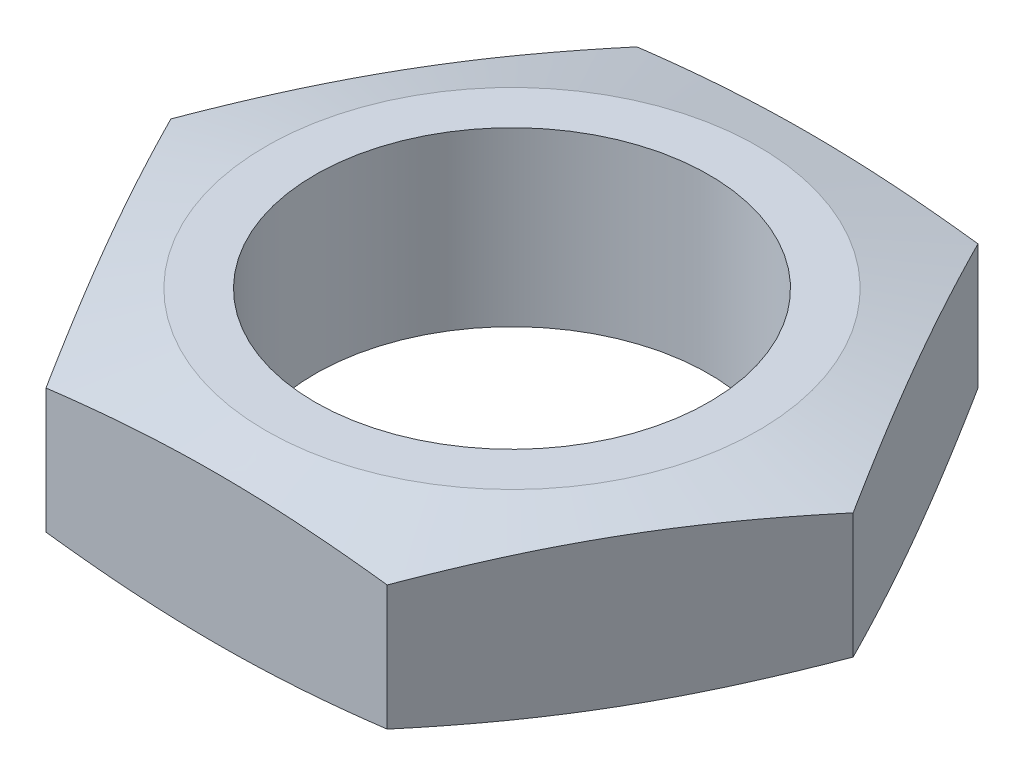
ISO-10303-21;
HEADER;
FILE_DESCRIPTION(('STEP AP214'),'2;1');
FILE_NAME('part.step','',(''),(''),'','','');
FILE_SCHEMA(('AUTOMOTIVE_DESIGN { 1 0 10303 214 1 1 1 1 }'));
ENDSEC;
DATA;
#1=APPLICATION_CONTEXT('core data for automotive mechanical design processes');
#2=APPLICATION_PROTOCOL_DEFINITION('international standard','automotive_design',2000,#1);
#3=PRODUCT_CONTEXT('',#1,'mechanical');
#4=PRODUCT('Part','Part','',(#3));
#5=PRODUCT_RELATED_PRODUCT_CATEGORY('part','',(#4));
#6=PRODUCT_DEFINITION_FORMATION('','',#4);
#7=PRODUCT_DEFINITION_CONTEXT('part definition',#1,'design');
#8=PRODUCT_DEFINITION('design','',#6,#7);
#9=PRODUCT_DEFINITION_SHAPE('','',#8);
#10=(LENGTH_UNIT() NAMED_UNIT(*) SI_UNIT(.MILLI.,.METRE.));
#11=(NAMED_UNIT(*) PLANE_ANGLE_UNIT() SI_UNIT($,.RADIAN.));
#12=(NAMED_UNIT(*) SI_UNIT($,.STERADIAN.) SOLID_ANGLE_UNIT());
#13=UNCERTAINTY_MEASURE_WITH_UNIT(LENGTH_MEASURE(1.E-05),#10,'distance_accuracy_value','');
#14=(GEOMETRIC_REPRESENTATION_CONTEXT(3) GLOBAL_UNCERTAINTY_ASSIGNED_CONTEXT((#13)) GLOBAL_UNIT_ASSIGNED_CONTEXT((#10,
#11,#12)) REPRESENTATION_CONTEXT('',''));
#15=CARTESIAN_POINT('',(0.,0.,0.));
#16=DIRECTION('',(0.,0.,1.));
#17=DIRECTION('',(1.,0.,0.));
#18=AXIS2_PLACEMENT_3D('',#15,#16,#17);
#19=CARTESIAN_POINT('',(0.,0.,0.));
#20=DIRECTION('',(0.,1.,0.));
#21=DIRECTION('',(0.,0.,1.));
#22=AXIS2_PLACEMENT_3D('',#19,#20,#21);
#23=PLANE('',#22);
#24=CARTESIAN_POINT('',(0.,0.,0.));
#25=DIRECTION('',(0.,1.,0.));
#26=DIRECTION('',(0.,0.,1.));
#27=AXIS2_PLACEMENT_3D('',#24,#25,#26);
#28=CIRCLE('',#27,4.);
#29=CARTESIAN_POINT('',(0.,0.,4.));
#30=VERTEX_POINT('',#29);
#31=EDGE_CURVE('E209',#30,#30,#28,.T.);
#32=ORIENTED_EDGE('',*,*,#31,.T.);
#33=EDGE_LOOP('',(#32));
#34=FACE_BOUND('',#33,.T.);
#35=CARTESIAN_POINT('',(0.,0.,0.));
#36=DIRECTION('',(0.,1.,0.));
#37=DIRECTION('',(0.,0.,1.));
#38=AXIS2_PLACEMENT_3D('',#35,#36,#37);
#39=CIRCLE('',#38,5.);
#40=CARTESIAN_POINT('',(0.,0.,5.));
#41=VERTEX_POINT('',#40);
#42=EDGE_CURVE('E108',#41,#41,#39,.T.);
#43=ORIENTED_EDGE('',*,*,#42,.F.);
#44=EDGE_LOOP('',(#43));
#45=FACE_BOUND('',#44,.T.);
#46=ADVANCED_FACE('F37',(#34,#45),#23,.F.);
#47=CARTESIAN_POINT('',(0.,3.5,0.));
#48=DIRECTION('',(0.,1.,0.));
#49=DIRECTION('',(0.,0.,1.));
#50=AXIS2_PLACEMENT_3D('',#47,#48,#49);
#51=PLANE('',#50);
#52=CARTESIAN_POINT('',(0.,3.5,0.));
#53=DIRECTION('',(0.,1.,0.));
#54=DIRECTION('',(0.,0.,1.));
#55=AXIS2_PLACEMENT_3D('',#52,#53,#54);
#56=CIRCLE('',#55,4.);
#57=CARTESIAN_POINT('',(0.,3.5,4.));
#58=VERTEX_POINT('',#57);
#59=EDGE_CURVE('E115',#58,#58,#56,.T.);
#60=ORIENTED_EDGE('',*,*,#59,.F.);
#61=EDGE_LOOP('',(#60));
#62=FACE_BOUND('',#61,.T.);
#63=CARTESIAN_POINT('',(0.,3.5,0.));
#64=DIRECTION('',(0.,1.,0.));
#65=DIRECTION('',(0.,0.,1.));
#66=AXIS2_PLACEMENT_3D('',#63,#64,#65);
#67=CIRCLE('',#66,5.);
#68=CARTESIAN_POINT('',(0.,3.5,5.));
#69=VERTEX_POINT('',#68);
#70=EDGE_CURVE('E236',#69,#69,#67,.T.);
#71=ORIENTED_EDGE('',*,*,#70,.T.);
#72=EDGE_LOOP('',(#71));
#73=FACE_BOUND('',#72,.T.);
#74=ADVANCED_FACE('F223',(#62,#73),#51,.T.);
#75=CARTESIAN_POINT('',(3.46410161513775,3.5,6.));
#76=DIRECTION('',(-0.866025403784439,0.,-0.5));
#77=DIRECTION('',(-0.5,0.,0.866025403784439));
#78=AXIS2_PLACEMENT_3D('',#75,#76,#77);
#79=PLANE('',#78);
#80=DIRECTION('',(0.,-1.,0.));
#81=VECTOR('',#80,1.);
#82=CARTESIAN_POINT('',(3.46410161513775,3.5,6.));
#83=LINE('',#82,#81);
#84=CARTESIAN_POINT('',(3.46410161513775,3.01794919243112,6.));
#85=VERTEX_POINT('',#84);
#86=CARTESIAN_POINT('',(3.46410161513775,0.482050807568877,6.));
#87=VERTEX_POINT('',#86);
#88=EDGE_CURVE('E111',#85,#87,#83,.T.);
#89=ORIENTED_EDGE('',*,*,#88,.T.);
#90=CARTESIAN_POINT('',(3.46398614508391,0.482079675804013,6.0002));
#91=CARTESIAN_POINT('',(3.60791299598261,0.446082306143699,5.75091138167007));
#92=CARTESIAN_POINT('',(3.75206751696797,0.41341285397183,5.50122842718267));
#93=CARTESIAN_POINT('',(4.04081988583842,0.356027888870937,5.00109465349319));
#94=CARTESIAN_POINT('',(4.18541787146394,0.331315169297714,4.75064359571766));
#95=CARTESIAN_POINT('',(4.474293036654,0.291259138583767,4.25029713256363));
#96=CARTESIAN_POINT('',(4.61856873409694,0.275874187563338,4.00040429429503));
#97=CARTESIAN_POINT('',(4.90728044914829,0.255245465624875,3.50034093508575));
#98=CARTESIAN_POINT('',(5.05171643592746,0.25,3.25017046754287));
#99=CARTESIAN_POINT('',(5.3405884094858,0.249999999999999,2.74982953245713));
#100=CARTESIAN_POINT('',(5.48502439626497,0.255245465624875,2.49965906491425));
#101=CARTESIAN_POINT('',(5.77373611131632,0.275874187563337,1.99959570570497));
#102=CARTESIAN_POINT('',(5.91801180875926,0.291259138583766,1.74970286743637));
#103=CARTESIAN_POINT('',(6.20688697394931,0.331315169297713,1.24935640428234));
#104=CARTESIAN_POINT('',(6.35148495957484,0.356027888870936,0.998905346506814));
#105=CARTESIAN_POINT('',(6.64023732844529,0.413412853971829,0.498771572817331));
#106=CARTESIAN_POINT('',(6.78439184943065,0.446082306143699,0.249088618329927));
#107=CARTESIAN_POINT('',(6.92831870032935,0.482079675804012,-0.00020000000000262));
#108=B_SPLINE_CURVE_WITH_KNOTS('',3,(#90,#91,#92,#93,#94,#95,#96,#97,#98,#99,#100,#101,#102,
#103,#104,#105,#106,#107),.UNSPECIFIED.,.F.,.F.,(4,2,2,2,2,2,2,2,4),(0.,0.870326629536244,
1.74095847075901,2.60767456513631,3.47424578463237,4.34081700412843,5.20753309850574,
6.0781649397285,6.94849156926474),.UNSPECIFIED.);
#109=CARTESIAN_POINT('',(6.92820323027551,0.482050807568876,0.));
#110=VERTEX_POINT('',#109);
#111=EDGE_CURVE('E58',#87,#110,#108,.T.);
#112=ORIENTED_EDGE('',*,*,#111,.T.);
#113=DIRECTION('',(0.,-1.,0.));
#114=VECTOR('',#113,1.);
#115=CARTESIAN_POINT('',(6.92820323027551,3.5,0.));
#116=LINE('',#115,#114);
#117=CARTESIAN_POINT('',(6.92820323027551,3.01794919243112,0.));
#118=VERTEX_POINT('',#117);
#119=EDGE_CURVE('E124',#118,#110,#116,.T.);
#120=ORIENTED_EDGE('',*,*,#119,.F.);
#121=CARTESIAN_POINT('',(6.92831870032934,3.01792032419599,-0.000200000000002631));
#122=CARTESIAN_POINT('',(6.78439184943065,3.0539176938563,0.249088618329928));
#123=CARTESIAN_POINT('',(6.64023732844529,3.08658714602817,0.498771572817332));
#124=CARTESIAN_POINT('',(6.35148495957484,3.14397211112906,0.998905346506814));
#125=CARTESIAN_POINT('',(6.20688697394931,3.16868483070229,1.24935640428234));
#126=CARTESIAN_POINT('',(5.91801180875926,3.20874086141623,1.74970286743637));
#127=CARTESIAN_POINT('',(5.77373611131632,3.22412581243666,1.99959570570497));
#128=CARTESIAN_POINT('',(5.48502439626497,3.24475453437513,2.49965906491425));
#129=CARTESIAN_POINT('',(5.3405884094858,3.25,2.74982953245713));
#130=CARTESIAN_POINT('',(5.05171643592746,3.25,3.25017046754287));
#131=CARTESIAN_POINT('',(4.90728044914829,3.24475453437512,3.50034093508575));
#132=CARTESIAN_POINT('',(4.61856873409694,3.22412581243666,4.00040429429504));
#133=CARTESIAN_POINT('',(4.474293036654,3.20874086141623,4.25029713256363));
#134=CARTESIAN_POINT('',(4.18541787146394,3.16868483070229,4.75064359571766));
#135=CARTESIAN_POINT('',(4.04081988583842,3.14397211112906,5.00109465349319));
#136=CARTESIAN_POINT('',(3.75206751696797,3.08658714602817,5.50122842718267));
#137=CARTESIAN_POINT('',(3.60791299598261,3.0539176938563,5.75091138167007));
#138=CARTESIAN_POINT('',(3.46398614508391,3.01792032419599,6.0002));
#139=B_SPLINE_CURVE_WITH_KNOTS('',3,(#121,#122,#123,#124,#125,#126,#127,#128,#129,#130,#131,
#132,#133,#134,#135,#136,#137,#138),.UNSPECIFIED.,.F.,.F.,(4,2,2,2,2,2,2,2,4),(0.,
0.870326629536245,1.74095847075901,2.60767456513631,3.47424578463237,4.34081700412843,
5.20753309850574,6.0781649397285,6.94849156926475),.UNSPECIFIED.);
#140=EDGE_CURVE('E199',#118,#85,#139,.T.);
#141=ORIENTED_EDGE('',*,*,#140,.T.);
#142=EDGE_LOOP('',(#89,#112,#120,#141));
#143=FACE_BOUND('',#142,.T.);
#144=ADVANCED_FACE('F39',(#143),#79,.F.);
#145=CARTESIAN_POINT('',(6.92820323027551,3.5,0.));
#146=DIRECTION('',(-0.866025403784438,0.,0.5));
#147=DIRECTION('',(0.5,0.,0.866025403784439));
#148=AXIS2_PLACEMENT_3D('',#145,#146,#147);
#149=PLANE('',#148);
#150=ORIENTED_EDGE('',*,*,#119,.T.);
#151=CARTESIAN_POINT('',(6.92831870032934,0.482079675804012,0.000199999999997421));
#152=CARTESIAN_POINT('',(6.78439184943065,0.446082306143699,-0.249088618329932));
#153=CARTESIAN_POINT('',(6.64023732844529,0.413412853971829,-0.498771572817336));
#154=CARTESIAN_POINT('',(6.35148495957484,0.356027888870936,-0.998905346506818));
#155=CARTESIAN_POINT('',(6.20688697394931,0.331315169297713,-1.24935640428234));
#156=CARTESIAN_POINT('',(5.91801180875926,0.291259138583766,-1.74970286743637));
#157=CARTESIAN_POINT('',(5.77373611131632,0.275874187563337,-1.99959570570497));
#158=CARTESIAN_POINT('',(5.48502439626497,0.255245465624875,-2.49965906491426));
#159=CARTESIAN_POINT('',(5.3405884094858,0.249999999999999,-2.74982953245713));
#160=CARTESIAN_POINT('',(5.05171643592746,0.249999999999999,-3.25017046754287));
#161=CARTESIAN_POINT('',(4.90728044914829,0.255245465624875,-3.50034093508575));
#162=CARTESIAN_POINT('',(4.61856873409694,0.275874187563338,-4.00040429429503));
#163=CARTESIAN_POINT('',(4.474293036654,0.291259138583767,-4.25029713256363));
#164=CARTESIAN_POINT('',(4.18541787146394,0.331315169297713,-4.75064359571766));
#165=CARTESIAN_POINT('',(4.04081988583842,0.356027888870936,-5.00109465349319));
#166=CARTESIAN_POINT('',(3.75206751696797,0.413412853971829,-5.50122842718267));
#167=CARTESIAN_POINT('',(3.60791299598261,0.446082306143699,-5.75091138167007));
#168=CARTESIAN_POINT('',(3.46398614508391,0.482079675804012,-6.0002));
#169=B_SPLINE_CURVE_WITH_KNOTS('',3,(#151,#152,#153,#154,#155,#156,#157,#158,#159,#160,#161,
#162,#163,#164,#165,#166,#167,#168),.UNSPECIFIED.,.F.,.F.,(4,2,2,2,2,2,2,2,4),(0.,
0.870326629536243,1.740958470759,2.60767456513631,3.47424578463237,4.34081700412843,
5.20753309850573,6.07816493972849,6.94849156926474),.UNSPECIFIED.);
#170=CARTESIAN_POINT('',(3.46410161513775,0.482050807568876,-6.));
#171=VERTEX_POINT('',#170);
#172=EDGE_CURVE('E176',#110,#171,#169,.T.);
#173=ORIENTED_EDGE('',*,*,#172,.T.);
#174=DIRECTION('',(0.,-1.,0.));
#175=VECTOR('',#174,1.);
#176=CARTESIAN_POINT('',(3.46410161513775,3.5,-6.));
#177=LINE('',#176,#175);
#178=CARTESIAN_POINT('',(3.46410161513775,3.01794919243112,-6.));
#179=VERTEX_POINT('',#178);
#180=EDGE_CURVE('E121',#179,#171,#177,.T.);
#181=ORIENTED_EDGE('',*,*,#180,.F.);
#182=CARTESIAN_POINT('',(3.46398614508391,3.01792032419599,-6.0002));
#183=CARTESIAN_POINT('',(3.60791299598261,3.0539176938563,-5.75091138167007));
#184=CARTESIAN_POINT('',(3.75206751696797,3.08658714602817,-5.50122842718267));
#185=CARTESIAN_POINT('',(4.04081988583842,3.14397211112906,-5.00109465349318));
#186=CARTESIAN_POINT('',(4.18541787146395,3.16868483070229,-4.75064359571766));
#187=CARTESIAN_POINT('',(4.474293036654,3.20874086141623,-4.25029713256363));
#188=CARTESIAN_POINT('',(4.61856873409694,3.22412581243666,-4.00040429429503));
#189=CARTESIAN_POINT('',(4.90728044914829,3.24475453437512,-3.50034093508575));
#190=CARTESIAN_POINT('',(5.05171643592746,3.25,-3.25017046754287));
#191=CARTESIAN_POINT('',(5.3405884094858,3.25,-2.74982953245713));
#192=CARTESIAN_POINT('',(5.48502439626497,3.24475453437512,-2.49965906491426));
#193=CARTESIAN_POINT('',(5.77373611131632,3.22412581243666,-1.99959570570497));
#194=CARTESIAN_POINT('',(5.91801180875926,3.20874086141623,-1.74970286743637));
#195=CARTESIAN_POINT('',(6.20688697394931,3.16868483070229,-1.24935640428234));
#196=CARTESIAN_POINT('',(6.35148495957484,3.14397211112906,-0.998905346506818));
#197=CARTESIAN_POINT('',(6.64023732844529,3.08658714602817,-0.498771572817336));
#198=CARTESIAN_POINT('',(6.78439184943065,3.0539176938563,-0.249088618329932));
#199=CARTESIAN_POINT('',(6.92831870032934,3.01792032419599,0.000199999999998099));
#200=B_SPLINE_CURVE_WITH_KNOTS('',3,(#182,#183,#184,#185,#186,#187,#188,#189,#190,#191,#192,
#193,#194,#195,#196,#197,#198,#199),.UNSPECIFIED.,.F.,.F.,(4,2,2,2,2,2,2,2,4),(0.,
0.870326629536244,1.74095847075901,2.60767456513631,3.47424578463237,4.34081700412843,
5.20753309850573,6.07816493972849,6.94849156926474),.UNSPECIFIED.);
#201=EDGE_CURVE('E192',#179,#118,#200,.T.);
#202=ORIENTED_EDGE('',*,*,#201,.T.);
#203=EDGE_LOOP('',(#150,#173,#181,#202));
#204=FACE_BOUND('',#203,.T.);
#205=ADVANCED_FACE('F184',(#204),#149,.F.);
#206=CARTESIAN_POINT('',(3.46410161513775,3.5,-6.));
#207=DIRECTION('',(0.,0.,1.));
#208=DIRECTION('',(1.,0.,0.));
#209=AXIS2_PLACEMENT_3D('',#206,#207,#208);
#210=PLANE('',#209);
#211=ORIENTED_EDGE('',*,*,#180,.T.);
#212=CARTESIAN_POINT('',(-9.17423322965147,1.49051267274986,-6.));
#213=CARTESIAN_POINT('',(-8.90182972676808,1.43353364412052,-6.));
#214=CARTESIAN_POINT('',(-8.62927713678384,1.37725468312102,-6.));
#215=CARTESIAN_POINT('',(-8.08380092016193,1.2664731607591,-6.));
#216=CARTESIAN_POINT('',(-7.81087727994329,1.21197066634669,-6.));
#217=CARTESIAN_POINT('',(-7.26437548743418,1.10507748387411,-6.));
#218=CARTESIAN_POINT('',(-6.99079697673439,1.0526886217299,-6.));
#219=CARTESIAN_POINT('',(-6.44314272850093,0.95057919178749,-6.));
#220=CARTESIAN_POINT('',(-6.16906699464885,0.900858604315271,-6.));
#221=CARTESIAN_POINT('',(-5.62224638174424,0.805052929565263,-6.));
#222=CARTESIAN_POINT('',(-5.34950553812237,0.758944922290212,-6.));
#223=CARTESIAN_POINT('',(-4.80337445053494,0.670757452445999,-6.));
#224=CARTESIAN_POINT('',(-4.52998421909875,0.628677912787756,-6.));
#225=CARTESIAN_POINT('',(-3.98250762589169,0.549488386195094,-6.));
#226=CARTESIAN_POINT('',(-3.70842133907103,0.512377885546651,-6.));
#227=CARTESIAN_POINT('',(-3.15948837210636,0.444211689099953,-6.));
#228=CARTESIAN_POINT('',(-2.88464169156165,0.41315599649306,-6.));
#229=CARTESIAN_POINT('',(-2.33151062300821,0.35800816857275,-6.));
#230=CARTESIAN_POINT('',(-2.05321900413627,0.333987500037012,-6.));
#231=CARTESIAN_POINT('',(-1.4960253142094,0.294481926340998,-6.));
#232=CARTESIAN_POINT('',(-1.21712325507909,0.278996855910514,-6.));
#233=CARTESIAN_POINT('',(-0.659058886005371,0.257449044996384,-6.));
#234=CARTESIAN_POINT('',(-0.379896723256258,0.251382567904947,-6.));
#235=CARTESIAN_POINT('',(0.17846923649888,0.249040038083327,-6.));
#236=CARTESIAN_POINT('',(0.457673033462369,0.252763975418432,-6.));
#237=CARTESIAN_POINT('',(1.01668768229813,0.269794320446198,-6.));
#238=CARTESIAN_POINT('',(1.29649757055305,0.283131732318117,-6.));
#239=CARTESIAN_POINT('',(1.85555141496436,0.318636037885371,-6.));
#240=CARTESIAN_POINT('',(2.13479536048404,0.340803096012409,-6.));
#241=CARTESIAN_POINT('',(2.69271068509262,0.392855962346945,-6.));
#242=CARTESIAN_POINT('',(2.97138165238261,0.422746117268975,-6.));
#243=CARTESIAN_POINT('',(3.52794307533916,0.4890094967451,-6.));
#244=CARTESIAN_POINT('',(3.80583352905615,0.525382737478085,-6.));
#245=CARTESIAN_POINT('',(4.34980119990638,0.601894951353838,-6.));
#246=CARTESIAN_POINT('',(4.61590793229184,0.641826133406714,-6.));
#247=CARTESIAN_POINT('',(5.14749184913678,0.725698715350364,-6.));
#248=CARTESIAN_POINT('',(5.41296901687129,0.769640220581429,-6.));
#249=CARTESIAN_POINT('',(5.94338358270451,0.860786091791574,-6.));
#250=CARTESIAN_POINT('',(6.20832093190465,0.907990740913816,-6.));
#251=CARTESIAN_POINT('',(6.73770985973436,1.00505606132603,-6.));
#252=CARTESIAN_POINT('',(7.00216143248385,1.05491676454998,-6.));
#253=CARTESIAN_POINT('',(7.79502114389458,1.2077482654487,-6.));
#254=CARTESIAN_POINT('',(8.32280652798961,1.3139459792742,-6.));
#255=CARTESIAN_POINT('',(9.37713634807312,1.53212721606324,-6.));
#256=CARTESIAN_POINT('',(9.90368085193043,1.64411041453699,-6.));
#257=CARTESIAN_POINT('',(10.9511969270296,1.8711094505808,-6.));
#258=CARTESIAN_POINT('',(11.4721763128507,1.98608932595033,-6.));
#259=CARTESIAN_POINT('',(12.5135023937464,2.21891245919898,-6.));
#260=CARTESIAN_POINT('',(13.0338490776566,2.33675576685668,-6.));
#261=CARTESIAN_POINT('',(14.0734514950714,2.57440871948367,-6.));
#262=CARTESIAN_POINT('',(14.5927077926461,2.69421590182929,-6.));
#263=CARTESIAN_POINT('',(15.6308288354789,2.93544493921223,-6.));
#264=CARTESIAN_POINT('',(16.1496935921478,3.05686674510904,-6.));
#265=CARTESIAN_POINT('',(16.6684231337661,3.17885658047219,-6.));
#266=B_SPLINE_CURVE_WITH_KNOTS('',3,(#212,#213,#214,#215,#216,#217,#218,#219,#220,#221,#222,
#223,#224,#225,#226,#227,#228,#229,#230,#231,#232,#233,#234,#235,#236,#237,#238,#239,#240,#241,
#242,#243,#244,#245,#246,#247,#248,#249,#250,#251,#252,#253,#254,#255,#256,#257,#258,#259,#260,
#261,#262,#263,#264,#265),.UNSPECIFIED.,.F.,.F.,(4,2,2,2,2,2,2,2,2,2,2,2,2,2,2,2,2,2,2,2,2,2,2,
2,2,2,4),(0.,0.834899671320353,1.66983077134979,2.50546834411569,3.34109975461824,
4.17090794112206,5.00070024517402,5.83040669648592,6.66011358511751,7.49797804055146,
8.33582627229541,9.17334202223063,10.0108569223066,10.8510850261057,11.6913287779382,
12.5320464699201,13.3727662599876,14.1799877654087,14.9872304804505,15.7945433281184,
16.601865884373,18.2169000716766,19.8318437748795,21.4323818721146,23.032947813417,
24.6316405976375,26.2302848370282),.UNSPECIFIED.);
#267=CARTESIAN_POINT('',(-3.46410161513775,0.482050807568877,-6.));
#268=VERTEX_POINT('',#267);
#269=EDGE_CURVE('E171',#171,#268,#266,.F.);
#270=ORIENTED_EDGE('',*,*,#269,.T.);
#271=DIRECTION('',(0.,-1.,0.));
#272=VECTOR('',#271,1.);
#273=CARTESIAN_POINT('',(-3.46410161513775,3.5,-6.));
#274=LINE('',#273,#272);
#275=CARTESIAN_POINT('',(-3.46410161513775,3.01794919243112,-6.));
#276=VERTEX_POINT('',#275);
#277=EDGE_CURVE('E113',#276,#268,#274,.T.);
#278=ORIENTED_EDGE('',*,*,#277,.F.);
#279=CARTESIAN_POINT('',(-9.17423322965147,2.00948732725014,-6.));
#280=CARTESIAN_POINT('',(-8.90182972676808,2.06646635587948,-6.));
#281=CARTESIAN_POINT('',(-8.62927713678384,2.12274531687898,-6.));
#282=CARTESIAN_POINT('',(-8.08380092016193,2.23352683924089,-6.));
#283=CARTESIAN_POINT('',(-7.81087727994329,2.28802933365331,-6.));
#284=CARTESIAN_POINT('',(-7.26437548743418,2.39492251612589,-6.));
#285=CARTESIAN_POINT('',(-6.99079697673439,2.4473113782701,-6.));
#286=CARTESIAN_POINT('',(-6.44314272850093,2.54942080821251,-6.));
#287=CARTESIAN_POINT('',(-6.16906699464885,2.59914139568473,-6.));
#288=CARTESIAN_POINT('',(-5.62224638174424,2.69494707043474,-6.));
#289=CARTESIAN_POINT('',(-5.34950553812237,2.74105507770979,-6.));
#290=CARTESIAN_POINT('',(-4.80337445053494,2.829242547554,-6.));
#291=CARTESIAN_POINT('',(-4.52998421909875,2.87132208721224,-6.));
#292=CARTESIAN_POINT('',(-3.98250762589169,2.95051161380491,-6.));
#293=CARTESIAN_POINT('',(-3.70842133907103,2.98762211445335,-6.));
#294=CARTESIAN_POINT('',(-3.15948837210637,3.05578831090005,-6.));
#295=CARTESIAN_POINT('',(-2.88464169156165,3.08684400350694,-6.));
#296=CARTESIAN_POINT('',(-2.33151062300821,3.14199183142725,-6.));
#297=CARTESIAN_POINT('',(-2.05321900413627,3.16601249996299,-6.));
#298=CARTESIAN_POINT('',(-1.4960253142094,3.205518073659,-6.));
#299=CARTESIAN_POINT('',(-1.21712325507909,3.22100314408949,-6.));
#300=CARTESIAN_POINT('',(-0.659058886005371,3.24255095500362,-6.));
#301=CARTESIAN_POINT('',(-0.379896723256258,3.24861743209505,-6.));
#302=CARTESIAN_POINT('',(0.17846923649888,3.25095996191667,-6.));
#303=CARTESIAN_POINT('',(0.45767303346237,3.24723602458157,-6.));
#304=CARTESIAN_POINT('',(1.01668768229813,3.2302056795538,-6.));
#305=CARTESIAN_POINT('',(1.29649757055305,3.21686826768188,-6.));
#306=CARTESIAN_POINT('',(1.85555141496436,3.18136396211463,-6.));
#307=CARTESIAN_POINT('',(2.13479536048404,3.15919690398759,-6.));
#308=CARTESIAN_POINT('',(2.69271068509262,3.10714403765305,-6.));
#309=CARTESIAN_POINT('',(2.97138165238261,3.07725388273102,-6.));
#310=CARTESIAN_POINT('',(3.52794307533916,3.0109905032549,-6.));
#311=CARTESIAN_POINT('',(3.80583352905615,2.97461726252191,-6.));
#312=CARTESIAN_POINT('',(4.34980119990638,2.89810504864616,-6.));
#313=CARTESIAN_POINT('',(4.61590793229184,2.85817386659329,-6.));
#314=CARTESIAN_POINT('',(5.14749184913678,2.77430128464964,-6.));
#315=CARTESIAN_POINT('',(5.41296901687128,2.73035977941857,-6.));
#316=CARTESIAN_POINT('',(5.94338358270451,2.63921390820843,-6.));
#317=CARTESIAN_POINT('',(6.20832093190464,2.59200925908618,-6.));
#318=CARTESIAN_POINT('',(6.73770985973436,2.49494393867397,-6.));
#319=CARTESIAN_POINT('',(7.00216143248385,2.44508323545002,-6.));
#320=CARTESIAN_POINT('',(7.79502114389457,2.2922517345513,-6.));
#321=CARTESIAN_POINT('',(8.32280652798961,2.1860540207258,-6.));
#322=CARTESIAN_POINT('',(9.37713634807312,1.96787278393676,-6.));
#323=CARTESIAN_POINT('',(9.90368085193043,1.85588958546301,-6.));
#324=CARTESIAN_POINT('',(10.9511969270296,1.6288905494192,-6.));
#325=CARTESIAN_POINT('',(11.4721763128507,1.51391067404967,-6.));
#326=CARTESIAN_POINT('',(12.5135023937464,1.28108754080102,-6.));
#327=CARTESIAN_POINT('',(13.0338490776566,1.16324423314332,-6.));
#328=CARTESIAN_POINT('',(14.0734514950714,0.925591280516326,-6.));
#329=CARTESIAN_POINT('',(14.5927077926461,0.805784098170715,-6.));
#330=CARTESIAN_POINT('',(15.6308288354789,0.564555060787767,-6.));
#331=CARTESIAN_POINT('',(16.1496935921478,0.443133254890965,-6.));
#332=CARTESIAN_POINT('',(16.6684231337661,0.321143419527806,-6.));
#333=B_SPLINE_CURVE_WITH_KNOTS('',3,(#279,#280,#281,#282,#283,#284,#285,#286,#287,#288,#289,
#290,#291,#292,#293,#294,#295,#296,#297,#298,#299,#300,#301,#302,#303,#304,#305,#306,#307,#308,
#309,#310,#311,#312,#313,#314,#315,#316,#317,#318,#319,#320,#321,#322,#323,#324,#325,#326,#327,
#328,#329,#330,#331,#332),.UNSPECIFIED.,.F.,.F.,(4,2,2,2,2,2,2,2,2,2,2,2,2,2,2,2,2,2,2,2,2,2,2,
2,2,2,4),(0.,0.834899671320355,1.66983077134979,2.50546834411569,3.34109975461824,
4.17090794112206,5.00070024517402,5.83040669648592,6.66011358511752,7.49797804055146,
8.33582627229541,9.17334202223063,10.0108569223066,10.8510850261057,11.6913287779382,
12.5320464699201,13.3727662599876,14.1799877654087,14.9872304804505,15.7945433281184,
16.601865884373,18.2169000716766,19.8318437748795,21.4323818721146,23.032947813417,
24.6316405976375,26.2302848370282),.UNSPECIFIED.);
#334=EDGE_CURVE('E200',#276,#179,#333,.T.);
#335=ORIENTED_EDGE('',*,*,#334,.T.);
#336=EDGE_LOOP('',(#211,#270,#278,#335));
#337=FACE_BOUND('',#336,.T.);
#338=ADVANCED_FACE('F187',(#337),#210,.F.);
#339=CARTESIAN_POINT('',(-3.46410161513775,3.5,-6.));
#340=DIRECTION('',(0.866025403784439,0.,0.5));
#341=DIRECTION('',(0.5,0.,-0.866025403784439));
#342=AXIS2_PLACEMENT_3D('',#339,#340,#341);
#343=PLANE('',#342);
#344=ORIENTED_EDGE('',*,*,#277,.T.);
#345=CARTESIAN_POINT('',(-3.46398614508391,0.482079675804012,-6.0002));
#346=CARTESIAN_POINT('',(-3.60791299598261,0.446082306143699,-5.75091138167007));
#347=CARTESIAN_POINT('',(-3.75206751696797,0.413412853971829,-5.50122842718267));
#348=CARTESIAN_POINT('',(-4.04081988583842,0.356027888870936,-5.00109465349318));
#349=CARTESIAN_POINT('',(-4.18541787146395,0.331315169297713,-4.75064359571766));
#350=CARTESIAN_POINT('',(-4.474293036654,0.291259138583767,-4.25029713256363));
#351=CARTESIAN_POINT('',(-4.61856873409694,0.275874187563337,-4.00040429429503));
#352=CARTESIAN_POINT('',(-4.90728044914829,0.255245465624874,-3.50034093508574));
#353=CARTESIAN_POINT('',(-5.05171643592746,0.249999999999999,-3.25017046754287));
#354=CARTESIAN_POINT('',(-5.3405884094858,0.249999999999999,-2.74982953245713));
#355=CARTESIAN_POINT('',(-5.48502439626497,0.255245465624875,-2.49965906491425));
#356=CARTESIAN_POINT('',(-5.77373611131632,0.275874187563337,-1.99959570570497));
#357=CARTESIAN_POINT('',(-5.91801180875926,0.291259138583766,-1.74970286743637));
#358=CARTESIAN_POINT('',(-6.20688697394931,0.331315169297713,-1.24935640428234));
#359=CARTESIAN_POINT('',(-6.35148495957484,0.356027888870936,-0.998905346506814));
#360=CARTESIAN_POINT('',(-6.64023732844529,0.41341285397183,-0.498771572817332));
#361=CARTESIAN_POINT('',(-6.78439184943065,0.446082306143699,-0.249088618329928));
#362=CARTESIAN_POINT('',(-6.92831870032935,0.482079675804012,0.000200000000002221));
#363=B_SPLINE_CURVE_WITH_KNOTS('',3,(#345,#346,#347,#348,#349,#350,#351,#352,#353,#354,#355,
#356,#357,#358,#359,#360,#361,#362),.UNSPECIFIED.,.F.,.F.,(4,2,2,2,2,2,2,2,4),(0.,
0.870326629536244,1.74095847075901,2.60767456513631,3.47424578463237,4.34081700412843,
5.20753309850574,6.0781649397285,6.94849156926474),.UNSPECIFIED.);
#364=CARTESIAN_POINT('',(-6.92820323027551,0.482050807568877,0.));
#365=VERTEX_POINT('',#364);
#366=EDGE_CURVE('E107',#268,#365,#363,.T.);
#367=ORIENTED_EDGE('',*,*,#366,.T.);
#368=DIRECTION('',(0.,-1.,0.));
#369=VECTOR('',#368,1.);
#370=CARTESIAN_POINT('',(-6.92820323027551,3.5,0.));
#371=LINE('',#370,#369);
#372=CARTESIAN_POINT('',(-6.92820323027551,3.01794919243112,0.));
#373=VERTEX_POINT('',#372);
#374=EDGE_CURVE('E106',#373,#365,#371,.T.);
#375=ORIENTED_EDGE('',*,*,#374,.F.);
#376=CARTESIAN_POINT('',(-6.92831870032935,3.01792032419599,0.00020000000000348));
#377=CARTESIAN_POINT('',(-6.78439184943065,3.0539176938563,-0.249088618329927));
#378=CARTESIAN_POINT('',(-6.64023732844529,3.08658714602817,-0.498771572817331));
#379=CARTESIAN_POINT('',(-6.35148495957484,3.14397211112906,-0.998905346506813));
#380=CARTESIAN_POINT('',(-6.20688697394932,3.16868483070229,-1.24935640428234));
#381=CARTESIAN_POINT('',(-5.91801180875926,3.20874086141623,-1.74970286743637));
#382=CARTESIAN_POINT('',(-5.77373611131633,3.22412581243666,-1.99959570570496));
#383=CARTESIAN_POINT('',(-5.48502439626498,3.24475453437513,-2.49965906491425));
#384=CARTESIAN_POINT('',(-5.3405884094858,3.25,-2.74982953245712));
#385=CARTESIAN_POINT('',(-5.05171643592746,3.25,-3.25017046754287));
#386=CARTESIAN_POINT('',(-4.90728044914829,3.24475453437513,-3.50034093508574));
#387=CARTESIAN_POINT('',(-4.61856873409694,3.22412581243666,-4.00040429429503));
#388=CARTESIAN_POINT('',(-4.474293036654,3.20874086141623,-4.25029713256363));
#389=CARTESIAN_POINT('',(-4.18541787146395,3.16868483070229,-4.75064359571766));
#390=CARTESIAN_POINT('',(-4.04081988583842,3.14397211112906,-5.00109465349318));
#391=CARTESIAN_POINT('',(-3.75206751696797,3.08658714602817,-5.50122842718266));
#392=CARTESIAN_POINT('',(-3.60791299598261,3.0539176938563,-5.75091138167007));
#393=CARTESIAN_POINT('',(-3.46398614508391,3.01792032419599,-6.0002));
#394=B_SPLINE_CURVE_WITH_KNOTS('',3,(#376,#377,#378,#379,#380,#381,#382,#383,#384,#385,#386,
#387,#388,#389,#390,#391,#392,#393),.UNSPECIFIED.,.F.,.F.,(4,2,2,2,2,2,2,2,4),(0.,
0.870326629536244,1.74095847075901,2.60767456513631,3.47424578463237,4.34081700412843,
5.20753309850574,6.0781649397285,6.94849156926474),.UNSPECIFIED.);
#395=EDGE_CURVE('E237',#373,#276,#394,.T.);
#396=ORIENTED_EDGE('',*,*,#395,.T.);
#397=EDGE_LOOP('',(#344,#367,#375,#396));
#398=FACE_BOUND('',#397,.T.);
#399=ADVANCED_FACE('F143',(#398),#343,.F.);
#400=CARTESIAN_POINT('',(-6.92820323027551,3.5,0.));
#401=DIRECTION('',(0.866025403784439,0.,-0.5));
#402=DIRECTION('',(-0.5,0.,-0.866025403784439));
#403=AXIS2_PLACEMENT_3D('',#400,#401,#402);
#404=PLANE('',#403);
#405=ORIENTED_EDGE('',*,*,#374,.T.);
#406=CARTESIAN_POINT('',(-6.92831870032935,0.482079675804012,-0.000199999999996577));
#407=CARTESIAN_POINT('',(-6.78439184943065,0.446082306143699,0.249088618329934));
#408=CARTESIAN_POINT('',(-6.64023732844529,0.41341285397183,0.498771572817337));
#409=CARTESIAN_POINT('',(-6.35148495957484,0.356027888870937,0.998905346506819));
#410=CARTESIAN_POINT('',(-6.20688697394932,0.331315169297714,1.24935640428235));
#411=CARTESIAN_POINT('',(-5.91801180875926,0.291259138583767,1.74970286743637));
#412=CARTESIAN_POINT('',(-5.77373611131633,0.275874187563338,1.99959570570497));
#413=CARTESIAN_POINT('',(-5.48502439626498,0.255245465624876,2.49965906491426));
#414=CARTESIAN_POINT('',(-5.3405884094858,0.25,2.74982953245713));
#415=CARTESIAN_POINT('',(-5.05171643592746,0.25,3.25017046754288));
#416=CARTESIAN_POINT('',(-4.90728044914829,0.255245465624876,3.50034093508575));
#417=CARTESIAN_POINT('',(-4.61856873409694,0.275874187563339,4.00040429429504));
#418=CARTESIAN_POINT('',(-4.474293036654,0.291259138583768,4.25029713256364));
#419=CARTESIAN_POINT('',(-4.18541787146395,0.331315169297714,4.75064359571766));
#420=CARTESIAN_POINT('',(-4.04081988583842,0.356027888870937,5.00109465349319));
#421=CARTESIAN_POINT('',(-3.75206751696798,0.41341285397183,5.50122842718267));
#422=CARTESIAN_POINT('',(-3.60791299598261,0.4460823061437,5.75091138167007));
#423=CARTESIAN_POINT('',(-3.46398614508392,0.482079675804013,6.0002));
#424=B_SPLINE_CURVE_WITH_KNOTS('',3,(#406,#407,#408,#409,#410,#411,#412,#413,#414,#415,#416,
#417,#418,#419,#420,#421,#422,#423),.UNSPECIFIED.,.F.,.F.,(4,2,2,2,2,2,2,2,4),(0.,
0.870326629536244,1.74095847075901,2.60767456513631,3.47424578463237,4.34081700412843,
5.20753309850573,6.0781649397285,6.94849156926474),.UNSPECIFIED.);
#425=CARTESIAN_POINT('',(-3.46410161513776,0.482050807568876,6.));
#426=VERTEX_POINT('',#425);
#427=EDGE_CURVE('E94',#365,#426,#424,.T.);
#428=ORIENTED_EDGE('',*,*,#427,.T.);
#429=DIRECTION('',(0.,-1.,0.));
#430=VECTOR('',#429,1.);
#431=CARTESIAN_POINT('',(-3.46410161513775,3.5,6.));
#432=LINE('',#431,#430);
#433=CARTESIAN_POINT('',(-3.46410161513775,3.01794919243112,6.));
#434=VERTEX_POINT('',#433);
#435=EDGE_CURVE('E104',#434,#426,#432,.T.);
#436=ORIENTED_EDGE('',*,*,#435,.F.);
#437=CARTESIAN_POINT('',(-3.46398614508392,3.01792032419599,6.0002));
#438=CARTESIAN_POINT('',(-3.60791299598261,3.0539176938563,5.75091138167007));
#439=CARTESIAN_POINT('',(-3.75206751696798,3.08658714602817,5.50122842718267));
#440=CARTESIAN_POINT('',(-4.04081988583842,3.14397211112906,5.00109465349319));
#441=CARTESIAN_POINT('',(-4.18541787146395,3.16868483070229,4.75064359571766));
#442=CARTESIAN_POINT('',(-4.474293036654,3.20874086141623,4.25029713256364));
#443=CARTESIAN_POINT('',(-4.61856873409694,3.22412581243666,4.00040429429504));
#444=CARTESIAN_POINT('',(-4.90728044914829,3.24475453437512,3.50034093508575));
#445=CARTESIAN_POINT('',(-5.05171643592746,3.25,3.25017046754288));
#446=CARTESIAN_POINT('',(-5.3405884094858,3.25,2.74982953245713));
#447=CARTESIAN_POINT('',(-5.48502439626498,3.24475453437512,2.49965906491426));
#448=CARTESIAN_POINT('',(-5.77373611131633,3.22412581243666,1.99959570570497));
#449=CARTESIAN_POINT('',(-5.91801180875926,3.20874086141623,1.74970286743637));
#450=CARTESIAN_POINT('',(-6.20688697394932,3.16868483070229,1.24935640428234));
#451=CARTESIAN_POINT('',(-6.35148495957484,3.14397211112906,0.998905346506819));
#452=CARTESIAN_POINT('',(-6.64023732844529,3.08658714602817,0.498771572817337));
#453=CARTESIAN_POINT('',(-6.78439184943065,3.0539176938563,0.249088618329933));
#454=CARTESIAN_POINT('',(-6.92831870032935,3.01792032419599,-0.000199999999997));
#455=B_SPLINE_CURVE_WITH_KNOTS('',3,(#437,#438,#439,#440,#441,#442,#443,#444,#445,#446,#447,
#448,#449,#450,#451,#452,#453,#454),.UNSPECIFIED.,.F.,.F.,(4,2,2,2,2,2,2,2,4),(0.,
0.870326629536244,1.74095847075901,2.60767456513631,3.47424578463237,4.34081700412843,
5.20753309850573,6.0781649397285,6.94849156926474),.UNSPECIFIED.);
#456=EDGE_CURVE('E65',#434,#373,#455,.T.);
#457=ORIENTED_EDGE('',*,*,#456,.T.);
#458=EDGE_LOOP('',(#405,#428,#436,#457));
#459=FACE_BOUND('',#458,.T.);
#460=ADVANCED_FACE('F103',(#459),#404,.F.);
#461=CARTESIAN_POINT('',(-3.46410161513775,3.5,6.));
#462=DIRECTION('',(0.,0.,-1.));
#463=DIRECTION('',(-1.,0.,0.));
#464=AXIS2_PLACEMENT_3D('',#461,#462,#463);
#465=PLANE('',#464);
#466=ORIENTED_EDGE('',*,*,#435,.T.);
#467=CARTESIAN_POINT('',(-9.17423322965148,1.49051267274986,6.));
#468=CARTESIAN_POINT('',(-8.90182972676809,1.43353364412052,6.));
#469=CARTESIAN_POINT('',(-8.62927713678385,1.37725468312102,6.));
#470=CARTESIAN_POINT('',(-8.08380092016193,1.26647316075911,6.));
#471=CARTESIAN_POINT('',(-7.81087727994329,1.21197066634669,6.));
#472=CARTESIAN_POINT('',(-7.26437548743419,1.10507748387411,6.));
#473=CARTESIAN_POINT('',(-6.99079697673439,1.0526886217299,6.));
#474=CARTESIAN_POINT('',(-6.44314272850093,0.950579191787491,6.));
#475=CARTESIAN_POINT('',(-6.16906699464886,0.900858604315272,6.));
#476=CARTESIAN_POINT('',(-5.62224638174424,0.805052929565264,6.));
#477=CARTESIAN_POINT('',(-5.34950553812237,0.758944922290213,6.));
#478=CARTESIAN_POINT('',(-4.80337445053494,0.670757452446,6.));
#479=CARTESIAN_POINT('',(-4.52998421909875,0.628677912787757,6.));
#480=CARTESIAN_POINT('',(-3.9825076258917,0.549488386195095,6.));
#481=CARTESIAN_POINT('',(-3.70842133907103,0.512377885546652,6.));
#482=CARTESIAN_POINT('',(-3.15948837210637,0.444211689099954,6.));
#483=CARTESIAN_POINT('',(-2.88464169156166,0.413155996493061,6.));
#484=CARTESIAN_POINT('',(-2.33151062300821,0.358008168572751,6.));
#485=CARTESIAN_POINT('',(-2.05321900413627,0.333987500037013,6.));
#486=CARTESIAN_POINT('',(-1.4960253142094,0.294481926341,6.));
#487=CARTESIAN_POINT('',(-1.2171232550791,0.278996855910515,6.));
#488=CARTESIAN_POINT('',(-0.659058886005373,0.257449044996385,6.));
#489=CARTESIAN_POINT('',(-0.37989672325626,0.251382567904948,6.));
#490=CARTESIAN_POINT('',(0.178469236498878,0.249040038083328,6.));
#491=CARTESIAN_POINT('',(0.457673033462368,0.252763975418433,6.));
#492=CARTESIAN_POINT('',(1.01668768229812,0.269794320446199,6.));
#493=CARTESIAN_POINT('',(1.29649757055305,0.283131732318118,6.));
#494=CARTESIAN_POINT('',(1.85555141496436,0.318636037885371,6.));
#495=CARTESIAN_POINT('',(2.13479536048404,0.34080309601241,6.));
#496=CARTESIAN_POINT('',(2.69271068509262,0.392855962346946,6.));
#497=CARTESIAN_POINT('',(2.97138165238261,0.422746117268976,6.));
#498=CARTESIAN_POINT('',(3.52794307533916,0.489009496745101,6.));
#499=CARTESIAN_POINT('',(3.80583352905615,0.525382737478086,6.));
#500=CARTESIAN_POINT('',(4.34980119990639,0.60189495135384,6.));
#501=CARTESIAN_POINT('',(4.61590793229184,0.641826133406715,6.));
#502=CARTESIAN_POINT('',(5.14749184913678,0.725698715350365,6.));
#503=CARTESIAN_POINT('',(5.41296901687129,0.769640220581429,6.));
#504=CARTESIAN_POINT('',(5.94338358270451,0.860786091791575,6.));
#505=CARTESIAN_POINT('',(6.20832093190465,0.907990740913816,6.));
#506=CARTESIAN_POINT('',(6.73770985973436,1.00505606132603,6.));
#507=CARTESIAN_POINT('',(7.00216143248385,1.05491676454998,6.));
#508=CARTESIAN_POINT('',(7.79502114389457,1.2077482654487,6.));
#509=CARTESIAN_POINT('',(8.32280652798961,1.3139459792742,6.));
#510=CARTESIAN_POINT('',(9.37713634807312,1.53212721606324,6.));
#511=CARTESIAN_POINT('',(9.90368085193043,1.64411041453699,6.));
#512=CARTESIAN_POINT('',(10.9511969270296,1.8711094505808,6.));
#513=CARTESIAN_POINT('',(11.4721763128507,1.98608932595033,6.));
#514=CARTESIAN_POINT('',(12.5135023937464,2.21891245919898,6.));
#515=CARTESIAN_POINT('',(13.0338490776566,2.33675576685669,6.));
#516=CARTESIAN_POINT('',(14.0734514950714,2.57440871948367,6.));
#517=CARTESIAN_POINT('',(14.5927077926461,2.69421590182929,6.));
#518=CARTESIAN_POINT('',(15.6308288354789,2.93544493921223,6.));
#519=CARTESIAN_POINT('',(16.1496935921479,3.05686674510904,6.));
#520=CARTESIAN_POINT('',(16.6684231337661,3.1788565804722,6.));
#521=B_SPLINE_CURVE_WITH_KNOTS('',3,(#467,#468,#469,#470,#471,#472,#473,#474,#475,#476,#477,
#478,#479,#480,#481,#482,#483,#484,#485,#486,#487,#488,#489,#490,#491,#492,#493,#494,#495,#496,
#497,#498,#499,#500,#501,#502,#503,#504,#505,#506,#507,#508,#509,#510,#511,#512,#513,#514,#515,
#516,#517,#518,#519,#520),.UNSPECIFIED.,.F.,.F.,(4,2,2,2,2,2,2,2,2,2,2,2,2,2,2,2,2,2,2,2,2,2,2,
2,2,2,4),(0.,0.834899671320355,1.66983077134979,2.5054683441157,3.34109975461824,
4.17090794112206,5.00070024517402,5.83040669648592,6.66011358511752,7.49797804055147,
8.33582627229542,9.17334202223063,10.0108569223066,10.8510850261057,11.6913287779382,
12.5320464699201,13.3727662599876,14.1799877654087,14.9872304804506,15.7945433281184,
16.601865884373,18.2169000716766,19.8318437748795,21.4323818721146,23.032947813417,
24.6316405976375,26.2302848370282),.UNSPECIFIED.);
#522=EDGE_CURVE('E11',#426,#87,#521,.T.);
#523=ORIENTED_EDGE('',*,*,#522,.T.);
#524=ORIENTED_EDGE('',*,*,#88,.F.);
#525=CARTESIAN_POINT('',(-9.17423322965148,2.00948732725014,6.));
#526=CARTESIAN_POINT('',(-8.90182972676809,2.06646635587948,6.));
#527=CARTESIAN_POINT('',(-8.62927713678385,2.12274531687898,6.));
#528=CARTESIAN_POINT('',(-8.08380092016193,2.23352683924089,6.));
#529=CARTESIAN_POINT('',(-7.81087727994329,2.28802933365331,6.));
#530=CARTESIAN_POINT('',(-7.26437548743419,2.39492251612589,6.));
#531=CARTESIAN_POINT('',(-6.99079697673439,2.4473113782701,6.));
#532=CARTESIAN_POINT('',(-6.44314272850093,2.54942080821251,6.));
#533=CARTESIAN_POINT('',(-6.16906699464886,2.59914139568473,6.));
#534=CARTESIAN_POINT('',(-5.62224638174424,2.69494707043474,6.));
#535=CARTESIAN_POINT('',(-5.34950553812237,2.74105507770979,6.));
#536=CARTESIAN_POINT('',(-4.80337445053494,2.829242547554,6.));
#537=CARTESIAN_POINT('',(-4.52998421909875,2.87132208721224,6.));
#538=CARTESIAN_POINT('',(-3.9825076258917,2.9505116138049,6.));
#539=CARTESIAN_POINT('',(-3.70842133907103,2.98762211445335,6.));
#540=CARTESIAN_POINT('',(-3.15948837210637,3.05578831090005,6.));
#541=CARTESIAN_POINT('',(-2.88464169156166,3.08684400350694,6.));
#542=CARTESIAN_POINT('',(-2.33151062300821,3.14199183142725,6.));
#543=CARTESIAN_POINT('',(-2.05321900413627,3.16601249996299,6.));
#544=CARTESIAN_POINT('',(-1.4960253142094,3.205518073659,6.));
#545=CARTESIAN_POINT('',(-1.21712325507909,3.22100314408948,6.));
#546=CARTESIAN_POINT('',(-0.659058886005372,3.24255095500361,6.));
#547=CARTESIAN_POINT('',(-0.379896723256259,3.24861743209505,6.));
#548=CARTESIAN_POINT('',(0.178469236498879,3.25095996191667,6.));
#549=CARTESIAN_POINT('',(0.457673033462368,3.24723602458157,6.));
#550=CARTESIAN_POINT('',(1.01668768229813,3.2302056795538,6.));
#551=CARTESIAN_POINT('',(1.29649757055305,3.21686826768188,6.));
#552=CARTESIAN_POINT('',(1.85555141496436,3.18136396211463,6.));
#553=CARTESIAN_POINT('',(2.13479536048404,3.15919690398759,6.));
#554=CARTESIAN_POINT('',(2.69271068509262,3.10714403765305,6.));
#555=CARTESIAN_POINT('',(2.97138165238261,3.07725388273102,6.));
#556=CARTESIAN_POINT('',(3.52794307533916,3.0109905032549,6.));
#557=CARTESIAN_POINT('',(3.80583352905616,2.97461726252191,6.));
#558=CARTESIAN_POINT('',(4.34980119990639,2.89810504864616,6.));
#559=CARTESIAN_POINT('',(4.61590793229184,2.85817386659329,6.));
#560=CARTESIAN_POINT('',(5.14749184913678,2.77430128464963,6.));
#561=CARTESIAN_POINT('',(5.41296901687129,2.73035977941857,6.));
#562=CARTESIAN_POINT('',(5.94338358270451,2.63921390820843,6.));
#563=CARTESIAN_POINT('',(6.20832093190465,2.59200925908618,6.));
#564=CARTESIAN_POINT('',(6.73770985973436,2.49494393867397,6.));
#565=CARTESIAN_POINT('',(7.00216143248385,2.44508323545002,6.));
#566=CARTESIAN_POINT('',(7.79502114389457,2.2922517345513,6.));
#567=CARTESIAN_POINT('',(8.32280652798961,2.1860540207258,6.));
#568=CARTESIAN_POINT('',(9.37713634807312,1.96787278393676,6.));
#569=CARTESIAN_POINT('',(9.90368085193043,1.85588958546301,6.));
#570=CARTESIAN_POINT('',(10.9511969270296,1.6288905494192,6.));
#571=CARTESIAN_POINT('',(11.4721763128507,1.51391067404967,6.));
#572=CARTESIAN_POINT('',(12.5135023937464,1.28108754080102,6.));
#573=CARTESIAN_POINT('',(13.0338490776566,1.16324423314331,6.));
#574=CARTESIAN_POINT('',(14.0734514950714,0.925591280516326,6.));
#575=CARTESIAN_POINT('',(14.5927077926461,0.805784098170714,6.));
#576=CARTESIAN_POINT('',(15.6308288354789,0.564555060787766,6.));
#577=CARTESIAN_POINT('',(16.1496935921479,0.443133254890963,6.));
#578=CARTESIAN_POINT('',(16.6684231337661,0.321143419527803,6.));
#579=B_SPLINE_CURVE_WITH_KNOTS('',3,(#525,#526,#527,#528,#529,#530,#531,#532,#533,#534,#535,
#536,#537,#538,#539,#540,#541,#542,#543,#544,#545,#546,#547,#548,#549,#550,#551,#552,#553,#554,
#555,#556,#557,#558,#559,#560,#561,#562,#563,#564,#565,#566,#567,#568,#569,#570,#571,#572,#573,
#574,#575,#576,#577,#578),.UNSPECIFIED.,.F.,.F.,(4,2,2,2,2,2,2,2,2,2,2,2,2,2,2,2,2,2,2,2,2,2,2,
2,2,2,4),(0.,0.834899671320355,1.66983077134979,2.5054683441157,3.34109975461824,
4.17090794112206,5.00070024517402,5.83040669648592,6.66011358511752,7.49797804055147,
8.33582627229542,9.17334202223063,10.0108569223066,10.8510850261057,11.6913287779382,
12.5320464699201,13.3727662599876,14.1799877654087,14.9872304804506,15.7945433281184,
16.601865884373,18.2169000716766,19.8318437748795,21.4323818721146,23.032947813417,
24.6316405976375,26.2302848370282),.UNSPECIFIED.);
#580=EDGE_CURVE('E51',#85,#434,#579,.F.);
#581=ORIENTED_EDGE('',*,*,#580,.T.);
#582=EDGE_LOOP('',(#466,#523,#524,#581));
#583=FACE_BOUND('',#582,.T.);
#584=ADVANCED_FACE('F110',(#583),#465,.F.);
#585=CARTESIAN_POINT('',(0.,3.5,0.));
#586=DIRECTION('',(0.,-1.,0.));
#587=DIRECTION('',(0.,0.,-1.));
#588=AXIS2_PLACEMENT_3D('',#585,#586,#587);
#589=CYLINDRICAL_SURFACE('',#588,4.);
#590=ORIENTED_EDGE('',*,*,#59,.T.);
#591=EDGE_LOOP('',(#590));
#592=FACE_BOUND('',#591,.T.);
#593=ORIENTED_EDGE('',*,*,#31,.F.);
#594=EDGE_LOOP('',(#593));
#595=FACE_BOUND('',#594,.T.);
#596=ADVANCED_FACE('F137',(#592,#595),#589,.F.);
#597=CARTESIAN_POINT('',(0.,2.5,0.));
#598=DIRECTION('',(0.,-1.,0.));
#599=DIRECTION('',(0.,0.,-1.));
#600=AXIS2_PLACEMENT_3D('',#597,#598,#599);
#601=CONICAL_SURFACE('',#600,9.,1.32581766366803);
#602=ORIENTED_EDGE('',*,*,#70,.F.);
#603=EDGE_LOOP('',(#602));
#604=FACE_BOUND('',#603,.T.);
#605=ORIENTED_EDGE('',*,*,#201,.F.);
#606=ORIENTED_EDGE('',*,*,#334,.F.);
#607=ORIENTED_EDGE('',*,*,#395,.F.);
#608=ORIENTED_EDGE('',*,*,#456,.F.);
#609=ORIENTED_EDGE('',*,*,#580,.F.);
#610=ORIENTED_EDGE('',*,*,#140,.F.);
#611=EDGE_LOOP('',(#605,#606,#607,#608,#609,#610));
#612=FACE_BOUND('',#611,.T.);
#613=ADVANCED_FACE('F130',(#604,#612),#601,.T.);
#614=CARTESIAN_POINT('',(0.,0.,0.));
#615=DIRECTION('',(0.,1.,0.));
#616=DIRECTION('',(0.,0.,1.));
#617=AXIS2_PLACEMENT_3D('',#614,#615,#616);
#618=CONICAL_SURFACE('',#617,5.,1.32581766366803);
#619=ORIENTED_EDGE('',*,*,#42,.T.);
#620=EDGE_LOOP('',(#619));
#621=FACE_BOUND('',#620,.T.);
#622=ORIENTED_EDGE('',*,*,#522,.F.);
#623=ORIENTED_EDGE('',*,*,#427,.F.);
#624=ORIENTED_EDGE('',*,*,#366,.F.);
#625=ORIENTED_EDGE('',*,*,#269,.F.);
#626=ORIENTED_EDGE('',*,*,#172,.F.);
#627=ORIENTED_EDGE('',*,*,#111,.F.);
#628=EDGE_LOOP('',(#622,#623,#624,#625,#626,#627));
#629=FACE_BOUND('',#628,.T.);
#630=ADVANCED_FACE('F93',(#621,#629),#618,.T.);
#631=CLOSED_SHELL('',(#46,#74,#144,#205,#338,#399,#460,#584,#596,#613,#630));
#632=MANIFOLD_SOLID_BREP('B2',#631);
#633=ADVANCED_BREP_SHAPE_REPRESENTATION('',(#18,#632),#14);
#634=SHAPE_DEFINITION_REPRESENTATION(#9,#633);
ENDSEC;
END-ISO-10303-21;
